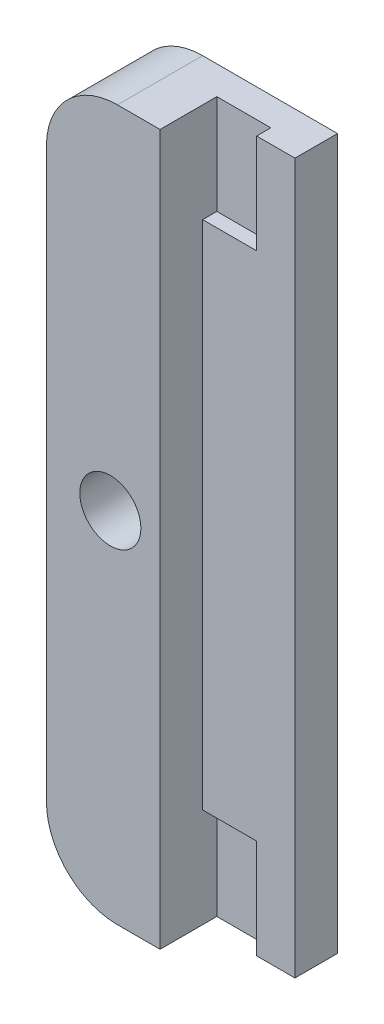
ISO-10303-21;
HEADER;
FILE_DESCRIPTION(('STEP AP214'),'2;1');
FILE_NAME('part.step','',(''),(''),'','','');
FILE_SCHEMA(('AUTOMOTIVE_DESIGN { 1 0 10303 214 1 1 1 1 }'));
ENDSEC;
DATA;
#1=APPLICATION_CONTEXT('core data for automotive mechanical design processes');
#2=APPLICATION_PROTOCOL_DEFINITION('international standard','automotive_design',2000,#1);
#3=PRODUCT_CONTEXT('',#1,'mechanical');
#4=PRODUCT('Part','Part','',(#3));
#5=PRODUCT_RELATED_PRODUCT_CATEGORY('part','',(#4));
#6=PRODUCT_DEFINITION_FORMATION('','',#4);
#7=PRODUCT_DEFINITION_CONTEXT('part definition',#1,'design');
#8=PRODUCT_DEFINITION('design','',#6,#7);
#9=PRODUCT_DEFINITION_SHAPE('','',#8);
#10=(LENGTH_UNIT() NAMED_UNIT(*) SI_UNIT(.MILLI.,.METRE.));
#11=(NAMED_UNIT(*) PLANE_ANGLE_UNIT() SI_UNIT($,.RADIAN.));
#12=(NAMED_UNIT(*) SI_UNIT($,.STERADIAN.) SOLID_ANGLE_UNIT());
#13=UNCERTAINTY_MEASURE_WITH_UNIT(LENGTH_MEASURE(1.E-05),#10,'distance_accuracy_value','');
#14=(GEOMETRIC_REPRESENTATION_CONTEXT(3) GLOBAL_UNCERTAINTY_ASSIGNED_CONTEXT((#13)) GLOBAL_UNIT_ASSIGNED_CONTEXT((#10,
#11,#12)) REPRESENTATION_CONTEXT('',''));
#15=CARTESIAN_POINT('',(0.,0.,0.));
#16=DIRECTION('',(0.,0.,1.));
#17=DIRECTION('',(1.,0.,0.));
#18=AXIS2_PLACEMENT_3D('',#15,#16,#17);
#19=CARTESIAN_POINT('',(-4.5,-25.,6.));
#20=DIRECTION('',(0.,1.,0.));
#21=DIRECTION('',(0.,0.,1.));
#22=AXIS2_PLACEMENT_3D('',#19,#20,#21);
#23=PLANE('',#22);
#24=DIRECTION('',(1.,0.,0.));
#25=VECTOR('',#24,1.);
#26=CARTESIAN_POINT('',(-4.5,-25.,6.));
#27=LINE('',#26,#25);
#28=CARTESIAN_POINT('',(0.500000000000001,-25.,6.));
#29=VERTEX_POINT('',#28);
#30=CARTESIAN_POINT('',(3.50000000000001,-25.,6.));
#31=VERTEX_POINT('',#30);
#32=EDGE_CURVE('E224',#29,#31,#27,.T.);
#33=ORIENTED_EDGE('',*,*,#32,.F.);
#34=DIRECTION('',(0.,0.,-1.));
#35=VECTOR('',#34,1.);
#36=CARTESIAN_POINT('',(0.500000000000003,-25.,6.));
#37=LINE('',#36,#35);
#38=CARTESIAN_POINT('',(0.500000000000001,-25.,0.));
#39=VERTEX_POINT('',#38);
#40=EDGE_CURVE('E11',#29,#39,#37,.T.);
#41=ORIENTED_EDGE('',*,*,#40,.T.);
#42=DIRECTION('',(1.,0.,0.));
#43=VECTOR('',#42,1.);
#44=CARTESIAN_POINT('',(-4.5,-25.,0.));
#45=LINE('',#44,#43);
#46=CARTESIAN_POINT('',(10.,-25.,0.));
#47=VERTEX_POINT('',#46);
#48=EDGE_CURVE('E232',#39,#47,#45,.T.);
#49=ORIENTED_EDGE('',*,*,#48,.T.);
#50=DIRECTION('',(0.,0.,-1.));
#51=VECTOR('',#50,1.);
#52=CARTESIAN_POINT('',(10.,-25.,6.));
#53=LINE('',#52,#51);
#54=CARTESIAN_POINT('',(10.,-25.,3.));
#55=VERTEX_POINT('',#54);
#56=EDGE_CURVE('E239',#55,#47,#53,.T.);
#57=ORIENTED_EDGE('',*,*,#56,.F.);
#58=DIRECTION('',(1.,0.,0.));
#59=VECTOR('',#58,1.);
#60=CARTESIAN_POINT('',(10.,-25.,3.));
#61=LINE('',#60,#59);
#62=CARTESIAN_POINT('',(7.30000000000001,-25.,3.));
#63=VERTEX_POINT('',#62);
#64=EDGE_CURVE('E208',#63,#55,#61,.T.);
#65=ORIENTED_EDGE('',*,*,#64,.F.);
#66=DIRECTION('',(0.,0.,-1.));
#67=VECTOR('',#66,1.);
#68=CARTESIAN_POINT('',(7.3,-25.,6.00000000000001));
#69=LINE('',#68,#67);
#70=CARTESIAN_POINT('',(7.30000000000001,-25.,2.));
#71=VERTEX_POINT('',#70);
#72=EDGE_CURVE('E152',#63,#71,#69,.T.);
#73=ORIENTED_EDGE('',*,*,#72,.T.);
#74=DIRECTION('',(-1.,0.,0.));
#75=VECTOR('',#74,1.);
#76=CARTESIAN_POINT('',(-4.5,-25.,2.));
#77=LINE('',#76,#75);
#78=CARTESIAN_POINT('',(3.50000000000001,-25.,2.));
#79=VERTEX_POINT('',#78);
#80=EDGE_CURVE('E163',#71,#79,#77,.T.);
#81=ORIENTED_EDGE('',*,*,#80,.T.);
#82=DIRECTION('',(0.,0.,-1.));
#83=VECTOR('',#82,1.);
#84=CARTESIAN_POINT('',(3.50000000000001,-25.,3.));
#85=LINE('',#84,#83);
#86=EDGE_CURVE('E195',#31,#79,#85,.T.);
#87=ORIENTED_EDGE('',*,*,#86,.F.);
#88=EDGE_LOOP('',(#33,#41,#49,#57,#65,#73,#81,#87));
#89=FACE_BOUND('',#88,.T.);
#90=ADVANCED_FACE('F34',(#89),#23,.F.);
#91=CARTESIAN_POINT('',(10.,32.1589105316382,3.));
#92=DIRECTION('',(0.,0.,-1.));
#93=DIRECTION('',(-1.,0.,0.));
#94=AXIS2_PLACEMENT_3D('',#91,#92,#93);
#95=PLANE('',#94);
#96=DIRECTION('',(0.,-1.,0.));
#97=VECTOR('',#96,1.);
#98=CARTESIAN_POINT('',(7.30000000000001,-18.,3.));
#99=LINE('',#98,#97);
#100=CARTESIAN_POINT('',(7.30000000000001,-18.,3.));
#101=VERTEX_POINT('',#100);
#102=EDGE_CURVE('E149',#101,#63,#99,.T.);
#103=ORIENTED_EDGE('',*,*,#102,.T.);
#104=ORIENTED_EDGE('',*,*,#64,.T.);
#105=DIRECTION('',(0.,-1.,0.));
#106=VECTOR('',#105,1.);
#107=CARTESIAN_POINT('',(10.,32.1589105316382,3.));
#108=LINE('',#107,#106);
#109=CARTESIAN_POINT('',(10.,25.,3.));
#110=VERTEX_POINT('',#109);
#111=EDGE_CURVE('E203',#110,#55,#108,.T.);
#112=ORIENTED_EDGE('',*,*,#111,.F.);
#113=DIRECTION('',(-1.,0.,0.));
#114=VECTOR('',#113,1.);
#115=CARTESIAN_POINT('',(10.,25.,3.));
#116=LINE('',#115,#114);
#117=CARTESIAN_POINT('',(7.30000000000001,25.,3.));
#118=VERTEX_POINT('',#117);
#119=EDGE_CURVE('E202',#110,#118,#116,.T.);
#120=ORIENTED_EDGE('',*,*,#119,.T.);
#121=DIRECTION('',(0.,1.,0.));
#122=VECTOR('',#121,1.);
#123=CARTESIAN_POINT('',(7.30000000000001,18.,3.));
#124=LINE('',#123,#122);
#125=CARTESIAN_POINT('',(7.30000000000001,18.,3.));
#126=VERTEX_POINT('',#125);
#127=EDGE_CURVE('E193',#126,#118,#124,.T.);
#128=ORIENTED_EDGE('',*,*,#127,.F.);
#129=DIRECTION('',(1.,0.,0.));
#130=VECTOR('',#129,1.);
#131=CARTESIAN_POINT('',(7.30000000000001,18.,3.));
#132=LINE('',#131,#130);
#133=CARTESIAN_POINT('',(3.50000000000001,18.,3.));
#134=VERTEX_POINT('',#133);
#135=EDGE_CURVE('E185',#134,#126,#132,.T.);
#136=ORIENTED_EDGE('',*,*,#135,.F.);
#137=DIRECTION('',(0.,-1.,0.));
#138=VECTOR('',#137,1.);
#139=CARTESIAN_POINT('',(3.50000000000001,32.1589105316382,3.));
#140=LINE('',#139,#138);
#141=CARTESIAN_POINT('',(3.50000000000001,-18.,3.));
#142=VERTEX_POINT('',#141);
#143=EDGE_CURVE('E162',#134,#142,#140,.T.);
#144=ORIENTED_EDGE('',*,*,#143,.T.);
#145=DIRECTION('',(1.,0.,0.));
#146=VECTOR('',#145,1.);
#147=CARTESIAN_POINT('',(-4.5,-18.,3.));
#148=LINE('',#147,#146);
#149=EDGE_CURVE('E142',#142,#101,#148,.T.);
#150=ORIENTED_EDGE('',*,*,#149,.T.);
#151=EDGE_LOOP('',(#103,#104,#112,#120,#128,#136,#144,#150));
#152=FACE_BOUND('',#151,.T.);
#153=ADVANCED_FACE('F159',(#152),#95,.F.);
#154=CARTESIAN_POINT('',(0.,0.,6.));
#155=DIRECTION('',(0.,0.,1.));
#156=DIRECTION('',(1.,0.,0.));
#157=AXIS2_PLACEMENT_3D('',#154,#155,#156);
#158=PLANE('',#157);
#159=DIRECTION('',(-1.,0.,0.));
#160=VECTOR('',#159,1.);
#161=CARTESIAN_POINT('',(-4.5,25.,6.));
#162=LINE('',#161,#160);
#163=CARTESIAN_POINT('',(3.50000000000001,25.,6.));
#164=VERTEX_POINT('',#163);
#165=CARTESIAN_POINT('',(0.500000000000001,25.,6.));
#166=VERTEX_POINT('',#165);
#167=EDGE_CURVE('E227',#164,#166,#162,.T.);
#168=ORIENTED_EDGE('',*,*,#167,.T.);
#169=CARTESIAN_POINT('',(0.500000000000003,20.,6.));
#170=DIRECTION('',(0.,0.,1.));
#171=DIRECTION('',(1.,0.,0.));
#172=AXIS2_PLACEMENT_3D('',#169,#170,#171);
#173=CIRCLE('',#172,5.);
#174=CARTESIAN_POINT('',(-4.5,20.,6.));
#175=VERTEX_POINT('',#174);
#176=EDGE_CURVE('E42',#166,#175,#173,.T.);
#177=ORIENTED_EDGE('',*,*,#176,.T.);
#178=DIRECTION('',(0.,-1.,0.));
#179=VECTOR('',#178,1.);
#180=CARTESIAN_POINT('',(-4.5,25.,6.));
#181=LINE('',#180,#179);
#182=CARTESIAN_POINT('',(-4.5,-20.,6.));
#183=VERTEX_POINT('',#182);
#184=EDGE_CURVE('E222',#175,#183,#181,.T.);
#185=ORIENTED_EDGE('',*,*,#184,.T.);
#186=CARTESIAN_POINT('',(0.500000000000003,-20.,6.));
#187=DIRECTION('',(0.,0.,1.));
#188=DIRECTION('',(1.,0.,0.));
#189=AXIS2_PLACEMENT_3D('',#186,#187,#188);
#190=CIRCLE('',#189,5.);
#191=EDGE_CURVE('E49',#183,#29,#190,.T.);
#192=ORIENTED_EDGE('',*,*,#191,.T.);
#193=ORIENTED_EDGE('',*,*,#32,.T.);
#194=DIRECTION('',(0.,-1.,0.));
#195=VECTOR('',#194,1.);
#196=CARTESIAN_POINT('',(3.50000000000001,32.1589105316382,6.));
#197=LINE('',#196,#195);
#198=EDGE_CURVE('E210',#164,#31,#197,.T.);
#199=ORIENTED_EDGE('',*,*,#198,.F.);
#200=EDGE_LOOP('',(#168,#177,#185,#192,#193,#199));
#201=FACE_BOUND('',#200,.T.);
#202=CARTESIAN_POINT('',(0.,0.,6.));
#203=DIRECTION('',(0.,0.,1.));
#204=DIRECTION('',(1.,0.,0.));
#205=AXIS2_PLACEMENT_3D('',#202,#203,#204);
#206=CIRCLE('',#205,2.15);
#207=CARTESIAN_POINT('',(2.15,0.,6.));
#208=VERTEX_POINT('',#207);
#209=EDGE_CURVE('E216',#208,#208,#206,.T.);
#210=ORIENTED_EDGE('',*,*,#209,.F.);
#211=EDGE_LOOP('',(#210));
#212=FACE_BOUND('',#211,.T.);
#213=ADVANCED_FACE('F254',(#201,#212),#158,.T.);
#214=CARTESIAN_POINT('',(0.,0.,0.));
#215=DIRECTION('',(0.,0.,1.));
#216=DIRECTION('',(1.,0.,0.));
#217=AXIS2_PLACEMENT_3D('',#214,#215,#216);
#218=PLANE('',#217);
#219=DIRECTION('',(0.,-1.,0.));
#220=VECTOR('',#219,1.);
#221=CARTESIAN_POINT('',(-4.5,25.,0.));
#222=LINE('',#221,#220);
#223=CARTESIAN_POINT('',(-4.5,20.,0.));
#224=VERTEX_POINT('',#223);
#225=CARTESIAN_POINT('',(-4.5,-20.,0.));
#226=VERTEX_POINT('',#225);
#227=EDGE_CURVE('E219',#224,#226,#222,.T.);
#228=ORIENTED_EDGE('',*,*,#227,.F.);
#229=CARTESIAN_POINT('',(0.500000000000003,20.,0.));
#230=DIRECTION('',(0.,0.,1.));
#231=DIRECTION('',(1.,0.,0.));
#232=AXIS2_PLACEMENT_3D('',#229,#230,#231);
#233=CIRCLE('',#232,5.);
#234=CARTESIAN_POINT('',(0.500000000000001,25.,0.));
#235=VERTEX_POINT('',#234);
#236=EDGE_CURVE('E249',#224,#235,#233,.F.);
#237=ORIENTED_EDGE('',*,*,#236,.T.);
#238=DIRECTION('',(-1.,0.,0.));
#239=VECTOR('',#238,1.);
#240=CARTESIAN_POINT('',(-4.5,25.,0.));
#241=LINE('',#240,#239);
#242=CARTESIAN_POINT('',(10.,25.,0.));
#243=VERTEX_POINT('',#242);
#244=EDGE_CURVE('E225',#243,#235,#241,.T.);
#245=ORIENTED_EDGE('',*,*,#244,.F.);
#246=DIRECTION('',(0.,1.,0.));
#247=VECTOR('',#246,1.);
#248=CARTESIAN_POINT('',(10.,25.,0.));
#249=LINE('',#248,#247);
#250=EDGE_CURVE('E234',#47,#243,#249,.T.);
#251=ORIENTED_EDGE('',*,*,#250,.F.);
#252=ORIENTED_EDGE('',*,*,#48,.F.);
#253=CARTESIAN_POINT('',(0.500000000000003,-20.,0.));
#254=DIRECTION('',(0.,0.,1.));
#255=DIRECTION('',(1.,0.,0.));
#256=AXIS2_PLACEMENT_3D('',#253,#254,#255);
#257=CIRCLE('',#256,5.);
#258=EDGE_CURVE('E247',#39,#226,#257,.F.);
#259=ORIENTED_EDGE('',*,*,#258,.T.);
#260=EDGE_LOOP('',(#228,#237,#245,#251,#252,#259));
#261=FACE_BOUND('',#260,.T.);
#262=CARTESIAN_POINT('',(0.,0.,0.));
#263=DIRECTION('',(0.,0.,1.));
#264=DIRECTION('',(1.,0.,0.));
#265=AXIS2_PLACEMENT_3D('',#262,#263,#264);
#266=CIRCLE('',#265,2.15);
#267=CARTESIAN_POINT('',(2.15,0.,0.));
#268=VERTEX_POINT('',#267);
#269=EDGE_CURVE('E206',#268,#268,#266,.T.);
#270=ORIENTED_EDGE('',*,*,#269,.T.);
#271=EDGE_LOOP('',(#270));
#272=FACE_BOUND('',#271,.T.);
#273=ADVANCED_FACE('F266',(#261,#272),#218,.F.);
#274=CARTESIAN_POINT('',(-4.5,25.,6.));
#275=DIRECTION('',(1.,0.,0.));
#276=DIRECTION('',(0.,0.,-1.));
#277=AXIS2_PLACEMENT_3D('',#274,#275,#276);
#278=PLANE('',#277);
#279=ORIENTED_EDGE('',*,*,#184,.F.);
#280=DIRECTION('',(0.,0.,-1.));
#281=VECTOR('',#280,1.);
#282=CARTESIAN_POINT('',(-4.5,20.,6.));
#283=LINE('',#282,#281);
#284=EDGE_CURVE('E244',#175,#224,#283,.T.);
#285=ORIENTED_EDGE('',*,*,#284,.T.);
#286=ORIENTED_EDGE('',*,*,#227,.T.);
#287=DIRECTION('',(0.,0.,-1.));
#288=VECTOR('',#287,1.);
#289=CARTESIAN_POINT('',(-4.5,-20.,6.));
#290=LINE('',#289,#288);
#291=EDGE_CURVE('E242',#226,#183,#290,.F.);
#292=ORIENTED_EDGE('',*,*,#291,.T.);
#293=EDGE_LOOP('',(#279,#285,#286,#292));
#294=FACE_BOUND('',#293,.T.);
#295=ADVANCED_FACE('F260',(#294),#278,.F.);
#296=CARTESIAN_POINT('',(10.,25.,6.));
#297=DIRECTION('',(-1.,0.,0.));
#298=DIRECTION('',(0.,0.,1.));
#299=AXIS2_PLACEMENT_3D('',#296,#297,#298);
#300=PLANE('',#299);
#301=DIRECTION('',(0.,0.,-1.));
#302=VECTOR('',#301,1.);
#303=CARTESIAN_POINT('',(10.,25.,6.));
#304=LINE('',#303,#302);
#305=EDGE_CURVE('E229',#110,#243,#304,.T.);
#306=ORIENTED_EDGE('',*,*,#305,.F.);
#307=ORIENTED_EDGE('',*,*,#111,.T.);
#308=ORIENTED_EDGE('',*,*,#56,.T.);
#309=ORIENTED_EDGE('',*,*,#250,.T.);
#310=EDGE_LOOP('',(#306,#307,#308,#309));
#311=FACE_BOUND('',#310,.T.);
#312=ADVANCED_FACE('F274',(#311),#300,.F.);
#313=CARTESIAN_POINT('',(-4.5,25.,6.));
#314=DIRECTION('',(0.,-1.,0.));
#315=DIRECTION('',(0.,0.,-1.));
#316=AXIS2_PLACEMENT_3D('',#313,#314,#315);
#317=PLANE('',#316);
#318=ORIENTED_EDGE('',*,*,#244,.T.);
#319=DIRECTION('',(0.,0.,-1.));
#320=VECTOR('',#319,1.);
#321=CARTESIAN_POINT('',(0.500000000000003,25.,6.));
#322=LINE('',#321,#320);
#323=EDGE_CURVE('E57',#235,#166,#322,.F.);
#324=ORIENTED_EDGE('',*,*,#323,.T.);
#325=ORIENTED_EDGE('',*,*,#167,.F.);
#326=DIRECTION('',(0.,0.,1.));
#327=VECTOR('',#326,1.);
#328=CARTESIAN_POINT('',(3.50000000000001,25.,3.));
#329=LINE('',#328,#327);
#330=CARTESIAN_POINT('',(3.50000000000001,25.,2.));
#331=VERTEX_POINT('',#330);
#332=EDGE_CURVE('E200',#331,#164,#329,.T.);
#333=ORIENTED_EDGE('',*,*,#332,.F.);
#334=DIRECTION('',(-1.,0.,0.));
#335=VECTOR('',#334,1.);
#336=CARTESIAN_POINT('',(7.30000000000001,25.,2.));
#337=LINE('',#336,#335);
#338=CARTESIAN_POINT('',(7.30000000000001,25.,2.));
#339=VERTEX_POINT('',#338);
#340=EDGE_CURVE('E180',#339,#331,#337,.T.);
#341=ORIENTED_EDGE('',*,*,#340,.F.);
#342=DIRECTION('',(0.,0.,-1.));
#343=VECTOR('',#342,1.);
#344=CARTESIAN_POINT('',(7.30000000000001,25.,3.));
#345=LINE('',#344,#343);
#346=EDGE_CURVE('E155',#118,#339,#345,.T.);
#347=ORIENTED_EDGE('',*,*,#346,.F.);
#348=ORIENTED_EDGE('',*,*,#119,.F.);
#349=ORIENTED_EDGE('',*,*,#305,.T.);
#350=EDGE_LOOP('',(#318,#324,#325,#333,#341,#347,#348,#349));
#351=FACE_BOUND('',#350,.T.);
#352=ADVANCED_FACE('F269',(#351),#317,.F.);
#353=CARTESIAN_POINT('',(0.,0.,6.));
#354=DIRECTION('',(0.,0.,-1.));
#355=DIRECTION('',(-1.,0.,0.));
#356=AXIS2_PLACEMENT_3D('',#353,#354,#355);
#357=CYLINDRICAL_SURFACE('',#356,2.15);
#358=ORIENTED_EDGE('',*,*,#209,.T.);
#359=EDGE_LOOP('',(#358));
#360=FACE_BOUND('',#359,.T.);
#361=ORIENTED_EDGE('',*,*,#269,.F.);
#362=EDGE_LOOP('',(#361));
#363=FACE_BOUND('',#362,.T.);
#364=ADVANCED_FACE('F306',(#360,#363),#357,.F.);
#365=CARTESIAN_POINT('',(3.50000000000001,32.1589105316382,3.));
#366=DIRECTION('',(-1.,0.,0.));
#367=DIRECTION('',(0.,0.,1.));
#368=AXIS2_PLACEMENT_3D('',#365,#366,#367);
#369=PLANE('',#368);
#370=ORIENTED_EDGE('',*,*,#332,.T.);
#371=ORIENTED_EDGE('',*,*,#198,.T.);
#372=ORIENTED_EDGE('',*,*,#86,.T.);
#373=DIRECTION('',(0.,-1.,0.));
#374=VECTOR('',#373,1.);
#375=CARTESIAN_POINT('',(3.50000000000001,-18.,2.));
#376=LINE('',#375,#374);
#377=CARTESIAN_POINT('',(3.50000000000001,-18.,2.));
#378=VERTEX_POINT('',#377);
#379=EDGE_CURVE('E171',#378,#79,#376,.T.);
#380=ORIENTED_EDGE('',*,*,#379,.F.);
#381=DIRECTION('',(0.,0.,1.));
#382=VECTOR('',#381,1.);
#383=CARTESIAN_POINT('',(3.5,-18.,6.));
#384=LINE('',#383,#382);
#385=EDGE_CURVE('E169',#378,#142,#384,.T.);
#386=ORIENTED_EDGE('',*,*,#385,.T.);
#387=ORIENTED_EDGE('',*,*,#143,.F.);
#388=DIRECTION('',(0.,0.,1.));
#389=VECTOR('',#388,1.);
#390=CARTESIAN_POINT('',(3.50000000000001,18.,3.));
#391=LINE('',#390,#389);
#392=CARTESIAN_POINT('',(3.50000000000001,18.,2.));
#393=VERTEX_POINT('',#392);
#394=EDGE_CURVE('E183',#393,#134,#391,.T.);
#395=ORIENTED_EDGE('',*,*,#394,.F.);
#396=DIRECTION('',(0.,1.,0.));
#397=VECTOR('',#396,1.);
#398=CARTESIAN_POINT('',(3.50000000000001,18.,2.));
#399=LINE('',#398,#397);
#400=EDGE_CURVE('E196',#393,#331,#399,.T.);
#401=ORIENTED_EDGE('',*,*,#400,.T.);
#402=EDGE_LOOP('',(#370,#371,#372,#380,#386,#387,#395,#401));
#403=FACE_BOUND('',#402,.T.);
#404=ADVANCED_FACE('F310',(#403),#369,.F.);
#405=CARTESIAN_POINT('',(7.30000000000001,18.,3.));
#406=DIRECTION('',(1.,0.,0.));
#407=DIRECTION('',(0.,0.,-1.));
#408=AXIS2_PLACEMENT_3D('',#405,#406,#407);
#409=PLANE('',#408);
#410=ORIENTED_EDGE('',*,*,#346,.T.);
#411=DIRECTION('',(0.,1.,0.));
#412=VECTOR('',#411,1.);
#413=CARTESIAN_POINT('',(7.30000000000001,18.,2.));
#414=LINE('',#413,#412);
#415=CARTESIAN_POINT('',(7.30000000000001,18.,2.));
#416=VERTEX_POINT('',#415);
#417=EDGE_CURVE('E188',#416,#339,#414,.T.);
#418=ORIENTED_EDGE('',*,*,#417,.F.);
#419=DIRECTION('',(0.,0.,-1.));
#420=VECTOR('',#419,1.);
#421=CARTESIAN_POINT('',(7.30000000000001,18.,3.));
#422=LINE('',#421,#420);
#423=EDGE_CURVE('E176',#126,#416,#422,.T.);
#424=ORIENTED_EDGE('',*,*,#423,.F.);
#425=ORIENTED_EDGE('',*,*,#127,.T.);
#426=EDGE_LOOP('',(#410,#418,#424,#425));
#427=FACE_BOUND('',#426,.T.);
#428=ADVANCED_FACE('F315',(#427),#409,.F.);
#429=CARTESIAN_POINT('',(7.30000000000001,18.,2.));
#430=DIRECTION('',(0.,0.,-1.));
#431=DIRECTION('',(-1.,0.,0.));
#432=AXIS2_PLACEMENT_3D('',#429,#430,#431);
#433=PLANE('',#432);
#434=ORIENTED_EDGE('',*,*,#340,.T.);
#435=ORIENTED_EDGE('',*,*,#400,.F.);
#436=DIRECTION('',(-1.,0.,0.));
#437=VECTOR('',#436,1.);
#438=CARTESIAN_POINT('',(7.30000000000001,18.,2.));
#439=LINE('',#438,#437);
#440=EDGE_CURVE('E179',#416,#393,#439,.T.);
#441=ORIENTED_EDGE('',*,*,#440,.F.);
#442=ORIENTED_EDGE('',*,*,#417,.T.);
#443=EDGE_LOOP('',(#434,#435,#441,#442));
#444=FACE_BOUND('',#443,.T.);
#445=ADVANCED_FACE('F322',(#444),#433,.F.);
#446=CARTESIAN_POINT('',(0.,18.,0.));
#447=DIRECTION('',(0.,1.,0.));
#448=DIRECTION('',(0.,0.,1.));
#449=AXIS2_PLACEMENT_3D('',#446,#447,#448);
#450=PLANE('',#449);
#451=ORIENTED_EDGE('',*,*,#423,.T.);
#452=ORIENTED_EDGE('',*,*,#440,.T.);
#453=ORIENTED_EDGE('',*,*,#394,.T.);
#454=ORIENTED_EDGE('',*,*,#135,.T.);
#455=EDGE_LOOP('',(#451,#452,#453,#454));
#456=FACE_BOUND('',#455,.T.);
#457=ADVANCED_FACE('F326',(#456),#450,.T.);
#458=CARTESIAN_POINT('',(7.3,-18.,6.00000000000001));
#459=DIRECTION('',(-1.,0.,0.));
#460=DIRECTION('',(0.,0.,1.));
#461=AXIS2_PLACEMENT_3D('',#458,#459,#460);
#462=PLANE('',#461);
#463=ORIENTED_EDGE('',*,*,#72,.F.);
#464=ORIENTED_EDGE('',*,*,#102,.F.);
#465=DIRECTION('',(0.,0.,-1.));
#466=VECTOR('',#465,1.);
#467=CARTESIAN_POINT('',(7.3,-18.,6.00000000000001));
#468=LINE('',#467,#466);
#469=CARTESIAN_POINT('',(7.30000000000001,-18.,2.));
#470=VERTEX_POINT('',#469);
#471=EDGE_CURVE('E137',#101,#470,#468,.T.);
#472=ORIENTED_EDGE('',*,*,#471,.T.);
#473=DIRECTION('',(0.,-1.,0.));
#474=VECTOR('',#473,1.);
#475=CARTESIAN_POINT('',(7.30000000000001,-18.,2.));
#476=LINE('',#475,#474);
#477=EDGE_CURVE('E156',#470,#71,#476,.T.);
#478=ORIENTED_EDGE('',*,*,#477,.T.);
#479=EDGE_LOOP('',(#463,#464,#472,#478));
#480=FACE_BOUND('',#479,.T.);
#481=ADVANCED_FACE('F150',(#480),#462,.T.);
#482=CARTESIAN_POINT('',(-4.5,-18.,2.));
#483=DIRECTION('',(0.,0.,1.));
#484=DIRECTION('',(1.,0.,0.));
#485=AXIS2_PLACEMENT_3D('',#482,#483,#484);
#486=PLANE('',#485);
#487=ORIENTED_EDGE('',*,*,#80,.F.);
#488=ORIENTED_EDGE('',*,*,#477,.F.);
#489=DIRECTION('',(-1.,0.,0.));
#490=VECTOR('',#489,1.);
#491=CARTESIAN_POINT('',(-4.5,-18.,2.));
#492=LINE('',#491,#490);
#493=EDGE_CURVE('E144',#470,#378,#492,.T.);
#494=ORIENTED_EDGE('',*,*,#493,.T.);
#495=ORIENTED_EDGE('',*,*,#379,.T.);
#496=EDGE_LOOP('',(#487,#488,#494,#495));
#497=FACE_BOUND('',#496,.T.);
#498=ADVANCED_FACE('F333',(#497),#486,.T.);
#499=CARTESIAN_POINT('',(0.,-18.,0.));
#500=DIRECTION('',(0.,1.,0.));
#501=DIRECTION('',(0.,0.,1.));
#502=AXIS2_PLACEMENT_3D('',#499,#500,#501);
#503=PLANE('',#502);
#504=ORIENTED_EDGE('',*,*,#149,.F.);
#505=ORIENTED_EDGE('',*,*,#385,.F.);
#506=ORIENTED_EDGE('',*,*,#493,.F.);
#507=ORIENTED_EDGE('',*,*,#471,.F.);
#508=EDGE_LOOP('',(#504,#505,#506,#507));
#509=FACE_BOUND('',#508,.T.);
#510=ADVANCED_FACE('F139',(#509),#503,.F.);
#511=CARTESIAN_POINT('',(0.500000000000003,20.,6.));
#512=DIRECTION('',(0.,0.,-1.));
#513=DIRECTION('',(-1.,0.,0.));
#514=AXIS2_PLACEMENT_3D('',#511,#512,#513);
#515=CYLINDRICAL_SURFACE('',#514,5.);
#516=ORIENTED_EDGE('',*,*,#176,.F.);
#517=ORIENTED_EDGE('',*,*,#323,.F.);
#518=ORIENTED_EDGE('',*,*,#236,.F.);
#519=ORIENTED_EDGE('',*,*,#284,.F.);
#520=EDGE_LOOP('',(#516,#517,#518,#519));
#521=FACE_BOUND('',#520,.T.);
#522=ADVANCED_FACE('F263',(#521),#515,.T.);
#523=CARTESIAN_POINT('',(0.500000000000003,-20.,6.));
#524=DIRECTION('',(0.,0.,-1.));
#525=DIRECTION('',(-1.,0.,0.));
#526=AXIS2_PLACEMENT_3D('',#523,#524,#525);
#527=CYLINDRICAL_SURFACE('',#526,5.);
#528=ORIENTED_EDGE('',*,*,#191,.F.);
#529=ORIENTED_EDGE('',*,*,#291,.F.);
#530=ORIENTED_EDGE('',*,*,#258,.F.);
#531=ORIENTED_EDGE('',*,*,#40,.F.);
#532=EDGE_LOOP('',(#528,#529,#530,#531));
#533=FACE_BOUND('',#532,.T.);
#534=ADVANCED_FACE('F36',(#533),#527,.T.);
#535=CLOSED_SHELL('',(#90,#153,#213,#273,#295,#312,#352,#364,#404,#428,#445,#457,#481,#498,#510,
#522,#534));
#536=MANIFOLD_SOLID_BREP('B2',#535);
#537=ADVANCED_BREP_SHAPE_REPRESENTATION('',(#18,#536),#14);
#538=SHAPE_DEFINITION_REPRESENTATION(#9,#537);
ENDSEC;
END-ISO-10303-21;
